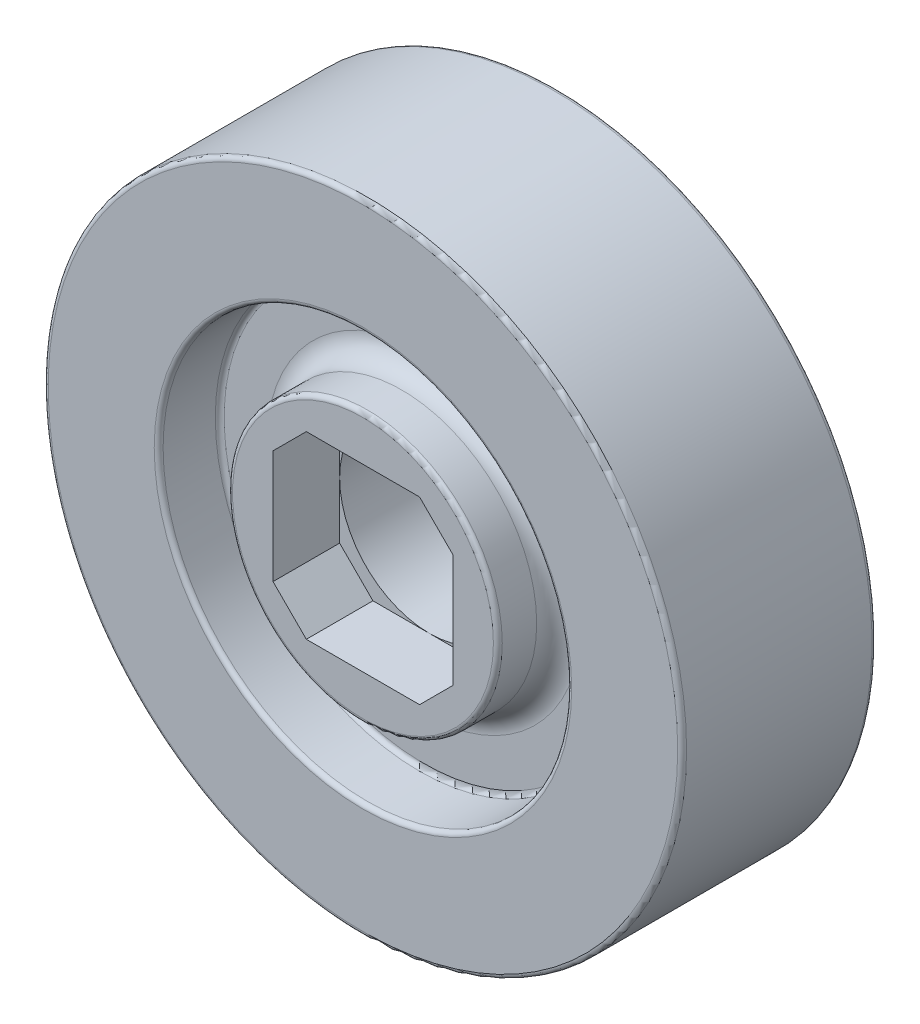
ISO-10303-21;
HEADER;
FILE_DESCRIPTION(('STEP AP214'),'2;1');
FILE_NAME('part.step','',(''),(''),'','','');
FILE_SCHEMA(('AUTOMOTIVE_DESIGN { 1 0 10303 214 1 1 1 1 }'));
ENDSEC;
DATA;
#1=APPLICATION_CONTEXT('core data for automotive mechanical design processes');
#2=APPLICATION_PROTOCOL_DEFINITION('international standard','automotive_design',2000,#1);
#3=PRODUCT_CONTEXT('',#1,'mechanical');
#4=PRODUCT('Part','Part','',(#3));
#5=PRODUCT_RELATED_PRODUCT_CATEGORY('part','',(#4));
#6=PRODUCT_DEFINITION_FORMATION('','',#4);
#7=PRODUCT_DEFINITION_CONTEXT('part definition',#1,'design');
#8=PRODUCT_DEFINITION('design','',#6,#7);
#9=PRODUCT_DEFINITION_SHAPE('','',#8);
#10=(LENGTH_UNIT() NAMED_UNIT(*) SI_UNIT(.MILLI.,.METRE.));
#11=(NAMED_UNIT(*) PLANE_ANGLE_UNIT() SI_UNIT($,.RADIAN.));
#12=(NAMED_UNIT(*) SI_UNIT($,.STERADIAN.) SOLID_ANGLE_UNIT());
#13=UNCERTAINTY_MEASURE_WITH_UNIT(LENGTH_MEASURE(1.E-05),#10,'distance_accuracy_value','');
#14=(GEOMETRIC_REPRESENTATION_CONTEXT(3) GLOBAL_UNCERTAINTY_ASSIGNED_CONTEXT((#13)) GLOBAL_UNIT_ASSIGNED_CONTEXT((#10,
#11,#12)) REPRESENTATION_CONTEXT('',''));
#15=CARTESIAN_POINT('',(0.,0.,0.));
#16=DIRECTION('',(0.,0.,1.));
#17=DIRECTION('',(1.,0.,0.));
#18=AXIS2_PLACEMENT_3D('',#15,#16,#17);
#19=CARTESIAN_POINT('',(-23.368,0.,-22.225));
#20=DIRECTION('',(0.,0.,-1.));
#21=DIRECTION('',(-1.,0.,0.));
#22=AXIS2_PLACEMENT_3D('',#19,#20,#21);
#23=PLANE('',#22);
#24=CARTESIAN_POINT('',(0.,0.,-22.225));
#25=DIRECTION('',(0.,0.,-1.));
#26=DIRECTION('',(-1.,0.,0.));
#27=AXIS2_PLACEMENT_3D('',#24,#25,#26);
#28=CIRCLE('',#27,36.0045);
#29=CARTESIAN_POINT('',(-36.0045,0.,-22.225));
#30=VERTEX_POINT('',#29);
#31=EDGE_CURVE('E215',#30,#30,#28,.T.);
#32=ORIENTED_EDGE('',*,*,#31,.T.);
#33=EDGE_LOOP('',(#32));
#34=FACE_BOUND('',#33,.T.);
#35=CARTESIAN_POINT('',(0.,0.,-22.225));
#36=DIRECTION('',(0.,0.,-1.));
#37=DIRECTION('',(-1.,0.,0.));
#38=AXIS2_PLACEMENT_3D('',#35,#36,#37);
#39=CIRCLE('',#38,23.876);
#40=CARTESIAN_POINT('',(-23.876,0.,-22.225));
#41=VERTEX_POINT('',#40);
#42=EDGE_CURVE('E212',#41,#41,#39,.F.);
#43=ORIENTED_EDGE('',*,*,#42,.T.);
#44=EDGE_LOOP('',(#43));
#45=FACE_BOUND('',#44,.T.);
#46=ADVANCED_FACE('F33',(#34,#45),#23,.T.);
#47=CARTESIAN_POINT('',(0.,0.,-23.33625));
#48=DIRECTION('',(0.,0.,-1.));
#49=DIRECTION('',(-1.,0.,0.));
#50=AXIS2_PLACEMENT_3D('',#47,#48,#49);
#51=CYLINDRICAL_SURFACE('',#50,36.5125);
#52=CARTESIAN_POINT('',(0.,0.,-0.508000000000002));
#53=DIRECTION('',(0.,0.,1.));
#54=DIRECTION('',(1.,0.,0.));
#55=AXIS2_PLACEMENT_3D('',#52,#53,#54);
#56=CIRCLE('',#55,36.5125);
#57=CARTESIAN_POINT('',(36.5125,0.,-0.508000000000002));
#58=VERTEX_POINT('',#57);
#59=EDGE_CURVE('E203',#58,#58,#56,.F.);
#60=ORIENTED_EDGE('',*,*,#59,.T.);
#61=EDGE_LOOP('',(#60));
#62=FACE_BOUND('',#61,.T.);
#63=CARTESIAN_POINT('',(0.,0.,-21.717));
#64=DIRECTION('',(0.,0.,-1.));
#65=DIRECTION('',(-1.,0.,0.));
#66=AXIS2_PLACEMENT_3D('',#63,#64,#65);
#67=CIRCLE('',#66,36.5125);
#68=CARTESIAN_POINT('',(-36.5125,0.,-21.717));
#69=VERTEX_POINT('',#68);
#70=EDGE_CURVE('E200',#69,#69,#67,.F.);
#71=ORIENTED_EDGE('',*,*,#70,.T.);
#72=EDGE_LOOP('',(#71));
#73=FACE_BOUND('',#72,.T.);
#74=ADVANCED_FACE('F249',(#62,#73),#51,.T.);
#75=CARTESIAN_POINT('',(-36.5125,0.,0.));
#76=DIRECTION('',(0.,0.,1.));
#77=DIRECTION('',(1.,0.,0.));
#78=AXIS2_PLACEMENT_3D('',#75,#76,#77);
#79=PLANE('',#78);
#80=CARTESIAN_POINT('',(0.,0.,0.));
#81=DIRECTION('',(0.,0.,1.));
#82=DIRECTION('',(1.,0.,0.));
#83=AXIS2_PLACEMENT_3D('',#80,#81,#82);
#84=CIRCLE('',#83,36.0045);
#85=CARTESIAN_POINT('',(36.0045,0.,0.));
#86=VERTEX_POINT('',#85);
#87=EDGE_CURVE('E209',#86,#86,#84,.T.);
#88=ORIENTED_EDGE('',*,*,#87,.T.);
#89=EDGE_LOOP('',(#88));
#90=FACE_BOUND('',#89,.T.);
#91=CARTESIAN_POINT('',(0.,0.,0.));
#92=DIRECTION('',(0.,0.,1.));
#93=DIRECTION('',(1.,0.,0.));
#94=AXIS2_PLACEMENT_3D('',#91,#92,#93);
#95=CIRCLE('',#94,23.876);
#96=CARTESIAN_POINT('',(23.876,0.,0.));
#97=VERTEX_POINT('',#96);
#98=EDGE_CURVE('E206',#97,#97,#95,.F.);
#99=ORIENTED_EDGE('',*,*,#98,.T.);
#100=EDGE_LOOP('',(#99));
#101=FACE_BOUND('',#100,.T.);
#102=ADVANCED_FACE('F255',(#90,#101),#79,.T.);
#103=CARTESIAN_POINT('',(0.,0.,-23.33625));
#104=DIRECTION('',(0.,0.,-1.));
#105=DIRECTION('',(-1.,0.,0.));
#106=AXIS2_PLACEMENT_3D('',#103,#104,#105);
#107=CYLINDRICAL_SURFACE('',#106,23.368);
#108=CARTESIAN_POINT('',(0.,0.,-6.477));
#109=DIRECTION('',(0.,0.,1.));
#110=DIRECTION('',(1.,0.,0.));
#111=AXIS2_PLACEMENT_3D('',#108,#109,#110);
#112=CIRCLE('',#111,23.368);
#113=CARTESIAN_POINT('',(23.368,0.,-6.477));
#114=VERTEX_POINT('',#113);
#115=EDGE_CURVE('E41',#114,#114,#112,.F.);
#116=ORIENTED_EDGE('',*,*,#115,.T.);
#117=EDGE_LOOP('',(#116));
#118=FACE_BOUND('',#117,.T.);
#119=CARTESIAN_POINT('',(0.,0.,-0.508000000000002));
#120=DIRECTION('',(0.,0.,1.));
#121=DIRECTION('',(1.,0.,0.));
#122=AXIS2_PLACEMENT_3D('',#119,#120,#121);
#123=CIRCLE('',#122,23.368);
#124=CARTESIAN_POINT('',(23.368,0.,-0.508000000000002));
#125=VERTEX_POINT('',#124);
#126=EDGE_CURVE('E227',#125,#125,#123,.T.);
#127=ORIENTED_EDGE('',*,*,#126,.T.);
#128=EDGE_LOOP('',(#127));
#129=FACE_BOUND('',#128,.T.);
#130=ADVANCED_FACE('F232',(#118,#129),#107,.F.);
#131=CARTESIAN_POINT('',(-23.368,0.,-6.985));
#132=DIRECTION('',(0.,0.,1.));
#133=DIRECTION('',(1.,0.,0.));
#134=AXIS2_PLACEMENT_3D('',#131,#132,#133);
#135=PLANE('',#134);
#136=CARTESIAN_POINT('',(0.,0.,-6.985));
#137=DIRECTION('',(0.,0.,1.));
#138=DIRECTION('',(1.,0.,0.));
#139=AXIS2_PLACEMENT_3D('',#136,#137,#138);
#140=CIRCLE('',#139,22.86);
#141=CARTESIAN_POINT('',(22.86,0.,-6.985));
#142=VERTEX_POINT('',#141);
#143=EDGE_CURVE('E11',#142,#142,#140,.T.);
#144=ORIENTED_EDGE('',*,*,#143,.T.);
#145=EDGE_LOOP('',(#144));
#146=FACE_BOUND('',#145,.T.);
#147=CARTESIAN_POINT('',(0.,0.,-6.985));
#148=DIRECTION('',(0.,0.,1.));
#149=DIRECTION('',(1.,0.,0.));
#150=AXIS2_PLACEMENT_3D('',#147,#148,#149);
#151=CIRCLE('',#150,17.9705);
#152=CARTESIAN_POINT('',(17.9705,0.,-6.985));
#153=VERTEX_POINT('',#152);
#154=EDGE_CURVE('E182',#153,#153,#151,.F.);
#155=ORIENTED_EDGE('',*,*,#154,.T.);
#156=EDGE_LOOP('',(#155));
#157=FACE_BOUND('',#156,.T.);
#158=ADVANCED_FACE('F398',(#146,#157),#135,.T.);
#159=CARTESIAN_POINT('',(0.,0.,-23.33625));
#160=DIRECTION('',(0.,0.,-1.));
#161=DIRECTION('',(-1.,0.,0.));
#162=AXIS2_PLACEMENT_3D('',#159,#160,#161);
#163=CYLINDRICAL_SURFACE('',#162,15.4305);
#164=CARTESIAN_POINT('',(0.,0.,-0.508000000000002));
#165=DIRECTION('',(0.,0.,1.));
#166=DIRECTION('',(1.,0.,0.));
#167=AXIS2_PLACEMENT_3D('',#164,#165,#166);
#168=CIRCLE('',#167,15.4305);
#169=CARTESIAN_POINT('',(15.4305,0.,-0.508000000000002));
#170=VERTEX_POINT('',#169);
#171=EDGE_CURVE('E221',#170,#170,#168,.F.);
#172=ORIENTED_EDGE('',*,*,#171,.T.);
#173=EDGE_LOOP('',(#172));
#174=FACE_BOUND('',#173,.T.);
#175=CARTESIAN_POINT('',(0.,0.,-4.445));
#176=DIRECTION('',(0.,0.,1.));
#177=DIRECTION('',(1.,0.,0.));
#178=AXIS2_PLACEMENT_3D('',#175,#176,#177);
#179=CIRCLE('',#178,15.4305);
#180=CARTESIAN_POINT('',(15.4305,0.,-4.445));
#181=VERTEX_POINT('',#180);
#182=EDGE_CURVE('E185',#181,#181,#179,.T.);
#183=ORIENTED_EDGE('',*,*,#182,.T.);
#184=EDGE_LOOP('',(#183));
#185=FACE_BOUND('',#184,.T.);
#186=ADVANCED_FACE('F394',(#174,#185),#163,.T.);
#187=CARTESIAN_POINT('',(-15.4305,0.,0.));
#188=DIRECTION('',(0.,0.,1.));
#189=DIRECTION('',(1.,0.,0.));
#190=AXIS2_PLACEMENT_3D('',#187,#188,#189);
#191=PLANE('',#190);
#192=CARTESIAN_POINT('',(0.,0.,0.));
#193=DIRECTION('',(0.,0.,1.));
#194=DIRECTION('',(1.,0.,0.));
#195=AXIS2_PLACEMENT_3D('',#192,#193,#194);
#196=CIRCLE('',#195,14.9225);
#197=CARTESIAN_POINT('',(14.9225,0.,0.));
#198=VERTEX_POINT('',#197);
#199=EDGE_CURVE('E224',#198,#198,#196,.T.);
#200=ORIENTED_EDGE('',*,*,#199,.T.);
#201=EDGE_LOOP('',(#200));
#202=FACE_BOUND('',#201,.T.);
#203=DIRECTION('',(1.,0.,0.));
#204=VECTOR('',#203,1.);
#205=CARTESIAN_POINT('',(-10.287,-10.287,0.));
#206=LINE('',#205,#204);
#207=CARTESIAN_POINT('',(-6.47699999999997,-10.287,0.));
#208=VERTEX_POINT('',#207);
#209=CARTESIAN_POINT('',(6.477,-10.287,0.));
#210=VERTEX_POINT('',#209);
#211=EDGE_CURVE('E142',#208,#210,#206,.T.);
#212=ORIENTED_EDGE('',*,*,#211,.F.);
#213=DIRECTION('',(0.707106781186551,-0.707106781186544,0.));
#214=VECTOR('',#213,1.);
#215=CARTESIAN_POINT('',(-6.47699999999997,-10.287,0.));
#216=LINE('',#215,#214);
#217=CARTESIAN_POINT('',(-10.287,-6.47700000000001,0.));
#218=VERTEX_POINT('',#217);
#219=EDGE_CURVE('E174',#208,#218,#216,.F.);
#220=ORIENTED_EDGE('',*,*,#219,.T.);
#221=DIRECTION('',(0.,-1.,0.));
#222=VECTOR('',#221,1.);
#223=CARTESIAN_POINT('',(-10.287,-10.287,0.));
#224=LINE('',#223,#222);
#225=CARTESIAN_POINT('',(-10.287,6.47699999999996,0.));
#226=VERTEX_POINT('',#225);
#227=EDGE_CURVE('E330',#226,#218,#224,.T.);
#228=ORIENTED_EDGE('',*,*,#227,.F.);
#229=DIRECTION('',(-0.707106781186543,-0.707106781186552,0.));
#230=VECTOR('',#229,1.);
#231=CARTESIAN_POINT('',(-10.287,6.47699999999996,0.));
#232=LINE('',#231,#230);
#233=CARTESIAN_POINT('',(-6.47700000000001,10.287,0.));
#234=VERTEX_POINT('',#233);
#235=EDGE_CURVE('E180',#226,#234,#232,.F.);
#236=ORIENTED_EDGE('',*,*,#235,.T.);
#237=DIRECTION('',(-1.,0.,0.));
#238=VECTOR('',#237,1.);
#239=CARTESIAN_POINT('',(-10.287,10.287,0.));
#240=LINE('',#239,#238);
#241=CARTESIAN_POINT('',(6.47699999999996,10.287,0.));
#242=VERTEX_POINT('',#241);
#243=EDGE_CURVE('E333',#242,#234,#240,.T.);
#244=ORIENTED_EDGE('',*,*,#243,.F.);
#245=DIRECTION('',(-0.707106781186551,0.707106781186544,0.));
#246=VECTOR('',#245,1.);
#247=CARTESIAN_POINT('',(6.47699999999996,10.287,0.));
#248=LINE('',#247,#246);
#249=CARTESIAN_POINT('',(10.287,6.477,0.));
#250=VERTEX_POINT('',#249);
#251=EDGE_CURVE('E178',#242,#250,#248,.F.);
#252=ORIENTED_EDGE('',*,*,#251,.T.);
#253=DIRECTION('',(0.,1.,0.));
#254=VECTOR('',#253,1.);
#255=CARTESIAN_POINT('',(10.287,-10.287,0.));
#256=LINE('',#255,#254);
#257=CARTESIAN_POINT('',(10.287,-6.47699999999997,0.));
#258=VERTEX_POINT('',#257);
#259=EDGE_CURVE('E335',#258,#250,#256,.T.);
#260=ORIENTED_EDGE('',*,*,#259,.F.);
#261=DIRECTION('',(0.707106781186544,0.707106781186551,0.));
#262=VECTOR('',#261,1.);
#263=CARTESIAN_POINT('',(10.287,-6.47699999999997,0.));
#264=LINE('',#263,#262);
#265=EDGE_CURVE('E176',#258,#210,#264,.F.);
#266=ORIENTED_EDGE('',*,*,#265,.T.);
#267=EDGE_LOOP('',(#212,#220,#228,#236,#244,#252,#260,#266));
#268=FACE_BOUND('',#267,.T.);
#269=ADVANCED_FACE('F353',(#202,#268),#191,.T.);
#270=CARTESIAN_POINT('',(0.,0.,-23.33625));
#271=DIRECTION('',(0.,0.,-1.));
#272=DIRECTION('',(-1.,0.,0.));
#273=AXIS2_PLACEMENT_3D('',#270,#271,#272);
#274=CYLINDRICAL_SURFACE('',#273,10.287);
#275=CARTESIAN_POINT('',(0.,0.,-7.62));
#276=DIRECTION('',(0.,0.,-1.));
#277=DIRECTION('',(-1.,0.,0.));
#278=AXIS2_PLACEMENT_3D('',#275,#276,#277);
#279=CIRCLE('',#278,10.287);
#280=CARTESIAN_POINT('',(-10.287,0.,-7.62));
#281=VERTEX_POINT('',#280);
#282=CARTESIAN_POINT('',(0.,10.287,-7.62));
#283=VERTEX_POINT('',#282);
#284=EDGE_CURVE('E136',#281,#283,#279,.T.);
#285=ORIENTED_EDGE('',*,*,#284,.F.);
#286=CARTESIAN_POINT('',(0.,-10.287,-7.62));
#287=VERTEX_POINT('',#286);
#288=EDGE_CURVE('E146',#287,#281,#279,.T.);
#289=ORIENTED_EDGE('',*,*,#288,.F.);
#290=CARTESIAN_POINT('',(10.287,0.,-7.62));
#291=VERTEX_POINT('',#290);
#292=EDGE_CURVE('E118',#291,#287,#279,.T.);
#293=ORIENTED_EDGE('',*,*,#292,.F.);
#294=EDGE_CURVE('E130',#283,#291,#279,.T.);
#295=ORIENTED_EDGE('',*,*,#294,.F.);
#296=EDGE_LOOP('',(#285,#289,#293,#295));
#297=FACE_BOUND('',#296,.T.);
#298=CARTESIAN_POINT('',(0.,0.,-18.288));
#299=DIRECTION('',(0.,0.,-1.));
#300=DIRECTION('',(-1.,0.,0.));
#301=AXIS2_PLACEMENT_3D('',#298,#299,#300);
#302=CIRCLE('',#301,10.287);
#303=CARTESIAN_POINT('',(-10.287,0.,-18.288));
#304=VERTEX_POINT('',#303);
#305=EDGE_CURVE('E147',#304,#304,#302,.T.);
#306=ORIENTED_EDGE('',*,*,#305,.T.);
#307=EDGE_LOOP('',(#306));
#308=FACE_BOUND('',#307,.T.);
#309=ADVANCED_FACE('F143',(#297,#308),#274,.F.);
#310=CARTESIAN_POINT('',(-10.287,0.,-18.288));
#311=DIRECTION('',(0.,0.,-1.));
#312=DIRECTION('',(-1.,0.,0.));
#313=AXIS2_PLACEMENT_3D('',#310,#311,#312);
#314=PLANE('',#313);
#315=CARTESIAN_POINT('',(0.,0.,-18.288));
#316=DIRECTION('',(0.,0.,-1.));
#317=DIRECTION('',(-1.,0.,0.));
#318=AXIS2_PLACEMENT_3D('',#315,#316,#317);
#319=CIRCLE('',#318,12.954);
#320=CARTESIAN_POINT('',(-12.954,0.,-18.288));
#321=VERTEX_POINT('',#320);
#322=EDGE_CURVE('E188',#321,#321,#319,.T.);
#323=ORIENTED_EDGE('',*,*,#322,.T.);
#324=EDGE_LOOP('',(#323));
#325=FACE_BOUND('',#324,.T.);
#326=ORIENTED_EDGE('',*,*,#305,.F.);
#327=EDGE_LOOP('',(#326));
#328=FACE_BOUND('',#327,.T.);
#329=ADVANCED_FACE('F385',(#325,#328),#314,.T.);
#330=CARTESIAN_POINT('',(0.,0.,-23.33625));
#331=DIRECTION('',(0.,0.,-1.));
#332=DIRECTION('',(-1.,0.,0.));
#333=AXIS2_PLACEMENT_3D('',#330,#331,#332);
#334=CYLINDRICAL_SURFACE('',#333,15.494);
#335=CARTESIAN_POINT('',(0.,0.,-15.748));
#336=DIRECTION('',(0.,0.,-1.));
#337=DIRECTION('',(-1.,0.,0.));
#338=AXIS2_PLACEMENT_3D('',#335,#336,#337);
#339=CIRCLE('',#338,15.494);
#340=CARTESIAN_POINT('',(-15.494,0.,-15.748));
#341=VERTEX_POINT('',#340);
#342=EDGE_CURVE('E191',#341,#341,#339,.F.);
#343=ORIENTED_EDGE('',*,*,#342,.T.);
#344=EDGE_LOOP('',(#343));
#345=FACE_BOUND('',#344,.T.);
#346=CARTESIAN_POINT('',(0.,0.,-15.24));
#347=DIRECTION('',(0.,0.,-1.));
#348=DIRECTION('',(-1.,0.,0.));
#349=AXIS2_PLACEMENT_3D('',#346,#347,#348);
#350=CIRCLE('',#349,15.494);
#351=CARTESIAN_POINT('',(-15.494,0.,-15.24));
#352=VERTEX_POINT('',#351);
#353=EDGE_CURVE('E321',#352,#352,#350,.T.);
#354=ORIENTED_EDGE('',*,*,#353,.T.);
#355=EDGE_LOOP('',(#354));
#356=FACE_BOUND('',#355,.T.);
#357=ADVANCED_FACE('F317',(#345,#356),#334,.T.);
#358=CARTESIAN_POINT('',(-15.494,0.,-15.24));
#359=DIRECTION('',(0.,0.,-1.));
#360=DIRECTION('',(-1.,0.,0.));
#361=AXIS2_PLACEMENT_3D('',#358,#359,#360);
#362=PLANE('',#361);
#363=CARTESIAN_POINT('',(0.,0.,-15.24));
#364=DIRECTION('',(0.,0.,-1.));
#365=DIRECTION('',(-1.,0.,0.));
#366=AXIS2_PLACEMENT_3D('',#363,#364,#365);
#367=CIRCLE('',#366,20.828);
#368=CARTESIAN_POINT('',(-20.828,0.,-15.24));
#369=VERTEX_POINT('',#368);
#370=EDGE_CURVE('E194',#369,#369,#367,.T.);
#371=ORIENTED_EDGE('',*,*,#370,.T.);
#372=EDGE_LOOP('',(#371));
#373=FACE_BOUND('',#372,.T.);
#374=ORIENTED_EDGE('',*,*,#353,.F.);
#375=EDGE_LOOP('',(#374));
#376=FACE_BOUND('',#375,.T.);
#377=ADVANCED_FACE('F309',(#373,#376),#362,.T.);
#378=CARTESIAN_POINT('',(0.,0.,-23.33625));
#379=DIRECTION('',(0.,0.,-1.));
#380=DIRECTION('',(-1.,0.,0.));
#381=AXIS2_PLACEMENT_3D('',#378,#379,#380);
#382=CYLINDRICAL_SURFACE('',#381,23.368);
#383=CARTESIAN_POINT('',(0.,0.,-21.717));
#384=DIRECTION('',(0.,0.,-1.));
#385=DIRECTION('',(-1.,0.,0.));
#386=AXIS2_PLACEMENT_3D('',#383,#384,#385);
#387=CIRCLE('',#386,23.368);
#388=CARTESIAN_POINT('',(-23.368,0.,-21.717));
#389=VERTEX_POINT('',#388);
#390=EDGE_CURVE('E218',#389,#389,#387,.T.);
#391=ORIENTED_EDGE('',*,*,#390,.T.);
#392=EDGE_LOOP('',(#391));
#393=FACE_BOUND('',#392,.T.);
#394=CARTESIAN_POINT('',(0.,0.,-17.78));
#395=DIRECTION('',(0.,0.,-1.));
#396=DIRECTION('',(-1.,0.,0.));
#397=AXIS2_PLACEMENT_3D('',#394,#395,#396);
#398=CIRCLE('',#397,23.368);
#399=CARTESIAN_POINT('',(-23.368,0.,-17.78));
#400=VERTEX_POINT('',#399);
#401=EDGE_CURVE('E197',#400,#400,#398,.F.);
#402=ORIENTED_EDGE('',*,*,#401,.T.);
#403=EDGE_LOOP('',(#402));
#404=FACE_BOUND('',#403,.T.);
#405=ADVANCED_FACE('F306',(#393,#404),#382,.F.);
#406=CARTESIAN_POINT('',(10.287,-10.287,-7.62));
#407=DIRECTION('',(1.,0.,0.));
#408=DIRECTION('',(0.,0.,-1.));
#409=AXIS2_PLACEMENT_3D('',#406,#407,#408);
#410=PLANE('',#409);
#411=DIRECTION('',(0.,1.,0.));
#412=VECTOR('',#411,1.);
#413=CARTESIAN_POINT('',(10.287,-10.287,-7.62));
#414=LINE('',#413,#412);
#415=CARTESIAN_POINT('',(10.287,-6.47699999999997,-7.62));
#416=VERTEX_POINT('',#415);
#417=EDGE_CURVE('E113',#416,#291,#414,.T.);
#418=ORIENTED_EDGE('',*,*,#417,.F.);
#419=DIRECTION('',(0.,0.,1.));
#420=VECTOR('',#419,1.);
#421=CARTESIAN_POINT('',(10.287,-6.47699999999997,0.));
#422=LINE('',#421,#420);
#423=EDGE_CURVE('E164',#416,#258,#422,.T.);
#424=ORIENTED_EDGE('',*,*,#423,.T.);
#425=ORIENTED_EDGE('',*,*,#259,.T.);
#426=DIRECTION('',(0.,0.,-1.));
#427=VECTOR('',#426,1.);
#428=CARTESIAN_POINT('',(10.287,6.477,-7.62));
#429=LINE('',#428,#427);
#430=CARTESIAN_POINT('',(10.287,6.477,-7.62));
#431=VERTEX_POINT('',#430);
#432=EDGE_CURVE('E141',#250,#431,#429,.T.);
#433=ORIENTED_EDGE('',*,*,#432,.T.);
#434=EDGE_CURVE('E127',#291,#431,#414,.T.);
#435=ORIENTED_EDGE('',*,*,#434,.F.);
#436=EDGE_LOOP('',(#418,#424,#425,#433,#435));
#437=FACE_BOUND('',#436,.T.);
#438=ADVANCED_FACE('F138',(#437),#410,.F.);
#439=CARTESIAN_POINT('',(-10.287,-10.287,-7.62));
#440=DIRECTION('',(0.,-1.,0.));
#441=DIRECTION('',(0.,0.,-1.));
#442=AXIS2_PLACEMENT_3D('',#439,#440,#441);
#443=PLANE('',#442);
#444=DIRECTION('',(1.,0.,0.));
#445=VECTOR('',#444,1.);
#446=CARTESIAN_POINT('',(-10.287,-10.287,-7.62));
#447=LINE('',#446,#445);
#448=CARTESIAN_POINT('',(-6.47699999999997,-10.287,-7.62));
#449=VERTEX_POINT('',#448);
#450=EDGE_CURVE('E323',#449,#287,#447,.T.);
#451=ORIENTED_EDGE('',*,*,#450,.F.);
#452=DIRECTION('',(0.,0.,1.));
#453=VECTOR('',#452,1.);
#454=CARTESIAN_POINT('',(-6.47699999999997,-10.287,0.));
#455=LINE('',#454,#453);
#456=EDGE_CURVE('E153',#449,#208,#455,.T.);
#457=ORIENTED_EDGE('',*,*,#456,.T.);
#458=ORIENTED_EDGE('',*,*,#211,.T.);
#459=DIRECTION('',(0.,0.,-1.));
#460=VECTOR('',#459,1.);
#461=CARTESIAN_POINT('',(6.477,-10.287,-7.62));
#462=LINE('',#461,#460);
#463=CARTESIAN_POINT('',(6.477,-10.287,-7.62));
#464=VERTEX_POINT('',#463);
#465=EDGE_CURVE('E151',#210,#464,#462,.T.);
#466=ORIENTED_EDGE('',*,*,#465,.T.);
#467=EDGE_CURVE('E325',#287,#464,#447,.T.);
#468=ORIENTED_EDGE('',*,*,#467,.F.);
#469=EDGE_LOOP('',(#451,#457,#458,#466,#468));
#470=FACE_BOUND('',#469,.T.);
#471=ADVANCED_FACE('F359',(#470),#443,.F.);
#472=CARTESIAN_POINT('',(-10.287,-10.287,-7.62));
#473=DIRECTION('',(-1.,0.,0.));
#474=DIRECTION('',(0.,0.,1.));
#475=AXIS2_PLACEMENT_3D('',#472,#473,#474);
#476=PLANE('',#475);
#477=ORIENTED_EDGE('',*,*,#227,.T.);
#478=DIRECTION('',(0.,0.,-1.));
#479=VECTOR('',#478,1.);
#480=CARTESIAN_POINT('',(-10.287,-6.47700000000001,-7.62));
#481=LINE('',#480,#479);
#482=CARTESIAN_POINT('',(-10.287,-6.47700000000001,-7.62));
#483=VERTEX_POINT('',#482);
#484=EDGE_CURVE('E159',#218,#483,#481,.T.);
#485=ORIENTED_EDGE('',*,*,#484,.T.);
#486=DIRECTION('',(0.,-1.,0.));
#487=VECTOR('',#486,1.);
#488=CARTESIAN_POINT('',(-10.287,-10.287,-7.62));
#489=LINE('',#488,#487);
#490=EDGE_CURVE('E339',#281,#483,#489,.T.);
#491=ORIENTED_EDGE('',*,*,#490,.F.);
#492=CARTESIAN_POINT('',(-10.287,6.47699999999996,-7.62));
#493=VERTEX_POINT('',#492);
#494=EDGE_CURVE('E337',#493,#281,#489,.T.);
#495=ORIENTED_EDGE('',*,*,#494,.F.);
#496=DIRECTION('',(0.,0.,1.));
#497=VECTOR('',#496,1.);
#498=CARTESIAN_POINT('',(-10.287,6.47699999999996,0.));
#499=LINE('',#498,#497);
#500=EDGE_CURVE('E156',#493,#226,#499,.T.);
#501=ORIENTED_EDGE('',*,*,#500,.T.);
#502=EDGE_LOOP('',(#477,#485,#491,#495,#501));
#503=FACE_BOUND('',#502,.T.);
#504=ADVANCED_FACE('F348',(#503),#476,.F.);
#505=CARTESIAN_POINT('',(-10.287,10.287,-7.62));
#506=DIRECTION('',(0.,1.,0.));
#507=DIRECTION('',(0.,0.,1.));
#508=AXIS2_PLACEMENT_3D('',#505,#506,#507);
#509=PLANE('',#508);
#510=DIRECTION('',(-1.,0.,0.));
#511=VECTOR('',#510,1.);
#512=CARTESIAN_POINT('',(-10.287,10.287,-7.62));
#513=LINE('',#512,#511);
#514=CARTESIAN_POINT('',(6.47699999999996,10.287,-7.62));
#515=VERTEX_POINT('',#514);
#516=EDGE_CURVE('E132',#515,#283,#513,.T.);
#517=ORIENTED_EDGE('',*,*,#516,.F.);
#518=DIRECTION('',(0.,0.,1.));
#519=VECTOR('',#518,1.);
#520=CARTESIAN_POINT('',(6.47699999999996,10.287,0.));
#521=LINE('',#520,#519);
#522=EDGE_CURVE('E168',#515,#242,#521,.T.);
#523=ORIENTED_EDGE('',*,*,#522,.T.);
#524=ORIENTED_EDGE('',*,*,#243,.T.);
#525=DIRECTION('',(0.,0.,-1.));
#526=VECTOR('',#525,1.);
#527=CARTESIAN_POINT('',(-6.47700000000001,10.287,-7.62));
#528=LINE('',#527,#526);
#529=CARTESIAN_POINT('',(-6.47700000000001,10.287,-7.62));
#530=VERTEX_POINT('',#529);
#531=EDGE_CURVE('E56',#234,#530,#528,.T.);
#532=ORIENTED_EDGE('',*,*,#531,.T.);
#533=EDGE_CURVE('E126',#283,#530,#513,.T.);
#534=ORIENTED_EDGE('',*,*,#533,.F.);
#535=EDGE_LOOP('',(#517,#523,#524,#532,#534));
#536=FACE_BOUND('',#535,.T.);
#537=ADVANCED_FACE('F370',(#536),#509,.F.);
#538=CARTESIAN_POINT('',(0.,0.,-7.62));
#539=DIRECTION('',(0.,0.,-1.));
#540=DIRECTION('',(-1.,0.,0.));
#541=AXIS2_PLACEMENT_3D('',#538,#539,#540);
#542=PLANE('',#541);
#543=ORIENTED_EDGE('',*,*,#533,.T.);
#544=DIRECTION('',(0.707106781186543,0.707106781186552,0.));
#545=VECTOR('',#544,1.);
#546=CARTESIAN_POINT('',(-10.287,6.47699999999996,-7.62));
#547=LINE('',#546,#545);
#548=EDGE_CURVE('E172',#530,#493,#547,.F.);
#549=ORIENTED_EDGE('',*,*,#548,.T.);
#550=ORIENTED_EDGE('',*,*,#494,.T.);
#551=ORIENTED_EDGE('',*,*,#284,.T.);
#552=EDGE_LOOP('',(#543,#549,#550,#551));
#553=FACE_BOUND('',#552,.T.);
#554=ADVANCED_FACE('F343',(#553),#542,.F.);
#555=ORIENTED_EDGE('',*,*,#434,.T.);
#556=DIRECTION('',(0.707106781186551,-0.707106781186544,0.));
#557=VECTOR('',#556,1.);
#558=CARTESIAN_POINT('',(6.47699999999996,10.287,-7.62));
#559=LINE('',#558,#557);
#560=EDGE_CURVE('E48',#431,#515,#559,.F.);
#561=ORIENTED_EDGE('',*,*,#560,.T.);
#562=ORIENTED_EDGE('',*,*,#516,.T.);
#563=ORIENTED_EDGE('',*,*,#294,.T.);
#564=EDGE_LOOP('',(#555,#561,#562,#563));
#565=FACE_BOUND('',#564,.T.);
#566=ADVANCED_FACE('F131',(#565),#542,.F.);
#567=ORIENTED_EDGE('',*,*,#467,.T.);
#568=DIRECTION('',(-0.707106781186544,-0.707106781186551,0.));
#569=VECTOR('',#568,1.);
#570=CARTESIAN_POINT('',(10.287,-6.47699999999997,-7.62));
#571=LINE('',#570,#569);
#572=EDGE_CURVE('E121',#464,#416,#571,.F.);
#573=ORIENTED_EDGE('',*,*,#572,.T.);
#574=ORIENTED_EDGE('',*,*,#417,.T.);
#575=ORIENTED_EDGE('',*,*,#292,.T.);
#576=EDGE_LOOP('',(#567,#573,#574,#575));
#577=FACE_BOUND('',#576,.T.);
#578=ADVANCED_FACE('F116',(#577),#542,.F.);
#579=ORIENTED_EDGE('',*,*,#490,.T.);
#580=DIRECTION('',(-0.707106781186551,0.707106781186544,0.));
#581=VECTOR('',#580,1.);
#582=CARTESIAN_POINT('',(-6.47699999999997,-10.287,-7.62));
#583=LINE('',#582,#581);
#584=EDGE_CURVE('E161',#483,#449,#583,.F.);
#585=ORIENTED_EDGE('',*,*,#584,.T.);
#586=ORIENTED_EDGE('',*,*,#450,.T.);
#587=ORIENTED_EDGE('',*,*,#288,.T.);
#588=EDGE_LOOP('',(#579,#585,#586,#587));
#589=FACE_BOUND('',#588,.T.);
#590=ADVANCED_FACE('F265',(#589),#542,.F.);
#591=CARTESIAN_POINT('',(-6.47699999999997,-10.287,-7.62));
#592=DIRECTION('',(0.707106781186544,0.707106781186551,0.));
#593=DIRECTION('',(0.,0.,-1.));
#594=AXIS2_PLACEMENT_3D('',#591,#592,#593);
#595=PLANE('',#594);
#596=ORIENTED_EDGE('',*,*,#584,.F.);
#597=ORIENTED_EDGE('',*,*,#484,.F.);
#598=ORIENTED_EDGE('',*,*,#219,.F.);
#599=ORIENTED_EDGE('',*,*,#456,.F.);
#600=EDGE_LOOP('',(#596,#597,#598,#599));
#601=FACE_BOUND('',#600,.T.);
#602=ADVANCED_FACE('F261',(#601),#595,.T.);
#603=CARTESIAN_POINT('',(10.287,-6.47699999999997,-7.62));
#604=DIRECTION('',(-0.707106781186551,0.707106781186544,0.));
#605=DIRECTION('',(0.,0.,-1.));
#606=AXIS2_PLACEMENT_3D('',#603,#604,#605);
#607=PLANE('',#606);
#608=ORIENTED_EDGE('',*,*,#572,.F.);
#609=ORIENTED_EDGE('',*,*,#465,.F.);
#610=ORIENTED_EDGE('',*,*,#265,.F.);
#611=ORIENTED_EDGE('',*,*,#423,.F.);
#612=EDGE_LOOP('',(#608,#609,#610,#611));
#613=FACE_BOUND('',#612,.T.);
#614=ADVANCED_FACE('F264',(#613),#607,.T.);
#615=CARTESIAN_POINT('',(6.47699999999996,10.287,-7.62));
#616=DIRECTION('',(-0.707106781186544,-0.707106781186551,0.));
#617=DIRECTION('',(0.,0.,-1.));
#618=AXIS2_PLACEMENT_3D('',#615,#616,#617);
#619=PLANE('',#618);
#620=ORIENTED_EDGE('',*,*,#560,.F.);
#621=ORIENTED_EDGE('',*,*,#432,.F.);
#622=ORIENTED_EDGE('',*,*,#251,.F.);
#623=ORIENTED_EDGE('',*,*,#522,.F.);
#624=EDGE_LOOP('',(#620,#621,#622,#623));
#625=FACE_BOUND('',#624,.T.);
#626=ADVANCED_FACE('F269',(#625),#619,.T.);
#627=CARTESIAN_POINT('',(-10.287,6.47699999999996,-7.62));
#628=DIRECTION('',(0.707106781186552,-0.707106781186543,0.));
#629=DIRECTION('',(0.,0.,-1.));
#630=AXIS2_PLACEMENT_3D('',#627,#628,#629);
#631=PLANE('',#630);
#632=ORIENTED_EDGE('',*,*,#548,.F.);
#633=ORIENTED_EDGE('',*,*,#531,.F.);
#634=ORIENTED_EDGE('',*,*,#235,.F.);
#635=ORIENTED_EDGE('',*,*,#500,.F.);
#636=EDGE_LOOP('',(#632,#633,#634,#635));
#637=FACE_BOUND('',#636,.T.);
#638=ADVANCED_FACE('F273',(#637),#631,.T.);
#639=CARTESIAN_POINT('',(0.,0.,-4.445));
#640=DIRECTION('',(0.,0.,1.));
#641=DIRECTION('',(1.,0.,0.));
#642=AXIS2_PLACEMENT_3D('',#639,#640,#641);
#643=TOROIDAL_SURFACE('',#642,17.9705,2.54);
#644=ORIENTED_EDGE('',*,*,#182,.F.);
#645=EDGE_LOOP('',(#644));
#646=FACE_BOUND('',#645,.T.);
#647=ORIENTED_EDGE('',*,*,#154,.F.);
#648=EDGE_LOOP('',(#647));
#649=FACE_BOUND('',#648,.T.);
#650=ADVANCED_FACE('F277',(#646,#649),#643,.F.);
#651=CARTESIAN_POINT('',(0.,0.,-15.748));
#652=DIRECTION('',(0.,0.,-1.));
#653=DIRECTION('',(-1.,0.,0.));
#654=AXIS2_PLACEMENT_3D('',#651,#652,#653);
#655=TOROIDAL_SURFACE('',#654,12.954,2.54);
#656=ORIENTED_EDGE('',*,*,#342,.F.);
#657=EDGE_LOOP('',(#656));
#658=FACE_BOUND('',#657,.T.);
#659=ORIENTED_EDGE('',*,*,#322,.F.);
#660=EDGE_LOOP('',(#659));
#661=FACE_BOUND('',#660,.T.);
#662=ADVANCED_FACE('F281',(#658,#661),#655,.T.);
#663=CARTESIAN_POINT('',(0.,0.,-17.78));
#664=DIRECTION('',(0.,0.,-1.));
#665=DIRECTION('',(-1.,0.,0.));
#666=AXIS2_PLACEMENT_3D('',#663,#664,#665);
#667=TOROIDAL_SURFACE('',#666,20.828,2.54);
#668=ORIENTED_EDGE('',*,*,#401,.F.);
#669=EDGE_LOOP('',(#668));
#670=FACE_BOUND('',#669,.T.);
#671=ORIENTED_EDGE('',*,*,#370,.F.);
#672=EDGE_LOOP('',(#671));
#673=FACE_BOUND('',#672,.T.);
#674=ADVANCED_FACE('F285',(#670,#673),#667,.F.);
#675=CARTESIAN_POINT('',(0.,0.,-0.508000000000002));
#676=DIRECTION('',(0.,0.,1.));
#677=DIRECTION('',(1.,0.,0.));
#678=AXIS2_PLACEMENT_3D('',#675,#676,#677);
#679=TOROIDAL_SURFACE('',#678,36.0045,0.508);
#680=ORIENTED_EDGE('',*,*,#87,.F.);
#681=EDGE_LOOP('',(#680));
#682=FACE_BOUND('',#681,.T.);
#683=ORIENTED_EDGE('',*,*,#59,.F.);
#684=EDGE_LOOP('',(#683));
#685=FACE_BOUND('',#684,.T.);
#686=ADVANCED_FACE('F289',(#682,#685),#679,.T.);
#687=CARTESIAN_POINT('',(0.,0.,-21.717));
#688=DIRECTION('',(0.,0.,-1.));
#689=DIRECTION('',(-1.,0.,0.));
#690=AXIS2_PLACEMENT_3D('',#687,#688,#689);
#691=TOROIDAL_SURFACE('',#690,36.0045,0.508);
#692=ORIENTED_EDGE('',*,*,#70,.F.);
#693=EDGE_LOOP('',(#692));
#694=FACE_BOUND('',#693,.T.);
#695=ORIENTED_EDGE('',*,*,#31,.F.);
#696=EDGE_LOOP('',(#695));
#697=FACE_BOUND('',#696,.T.);
#698=ADVANCED_FACE('F293',(#694,#697),#691,.T.);
#699=CARTESIAN_POINT('',(0.,0.,-21.717));
#700=DIRECTION('',(0.,0.,-1.));
#701=DIRECTION('',(-1.,0.,0.));
#702=AXIS2_PLACEMENT_3D('',#699,#700,#701);
#703=TOROIDAL_SURFACE('',#702,23.876,0.508);
#704=ORIENTED_EDGE('',*,*,#42,.F.);
#705=EDGE_LOOP('',(#704));
#706=FACE_BOUND('',#705,.T.);
#707=ORIENTED_EDGE('',*,*,#390,.F.);
#708=EDGE_LOOP('',(#707));
#709=FACE_BOUND('',#708,.T.);
#710=ADVANCED_FACE('F244',(#706,#709),#703,.T.);
#711=CARTESIAN_POINT('',(0.,0.,-0.508000000000002));
#712=DIRECTION('',(0.,0.,1.));
#713=DIRECTION('',(1.,0.,0.));
#714=AXIS2_PLACEMENT_3D('',#711,#712,#713);
#715=TOROIDAL_SURFACE('',#714,14.9225,0.508);
#716=ORIENTED_EDGE('',*,*,#199,.F.);
#717=EDGE_LOOP('',(#716));
#718=FACE_BOUND('',#717,.T.);
#719=ORIENTED_EDGE('',*,*,#171,.F.);
#720=EDGE_LOOP('',(#719));
#721=FACE_BOUND('',#720,.T.);
#722=ADVANCED_FACE('F237',(#718,#721),#715,.T.);
#723=CARTESIAN_POINT('',(0.,0.,-6.477));
#724=DIRECTION('',(0.,0.,1.));
#725=DIRECTION('',(1.,0.,0.));
#726=AXIS2_PLACEMENT_3D('',#723,#724,#725);
#727=TOROIDAL_SURFACE('',#726,22.86,0.508);
#728=ORIENTED_EDGE('',*,*,#143,.F.);
#729=EDGE_LOOP('',(#728));
#730=FACE_BOUND('',#729,.T.);
#731=ORIENTED_EDGE('',*,*,#115,.F.);
#732=EDGE_LOOP('',(#731));
#733=FACE_BOUND('',#732,.T.);
#734=ADVANCED_FACE('F235',(#730,#733),#727,.F.);
#735=CARTESIAN_POINT('',(0.,0.,-0.508000000000002));
#736=DIRECTION('',(0.,0.,1.));
#737=DIRECTION('',(1.,0.,0.));
#738=AXIS2_PLACEMENT_3D('',#735,#736,#737);
#739=TOROIDAL_SURFACE('',#738,23.876,0.508);
#740=ORIENTED_EDGE('',*,*,#126,.F.);
#741=EDGE_LOOP('',(#740));
#742=FACE_BOUND('',#741,.T.);
#743=ORIENTED_EDGE('',*,*,#98,.F.);
#744=EDGE_LOOP('',(#743));
#745=FACE_BOUND('',#744,.T.);
#746=ADVANCED_FACE('F35',(#742,#745),#739,.T.);
#747=CLOSED_SHELL('',(#46,#74,#102,#130,#158,#186,#269,#309,#329,#357,#377,#405,#438,#471,#504,
#537,#554,#566,#578,#590,#602,#614,#626,#638,#650,#662,#674,#686,#698,#710,#722,#734,#746));
#748=MANIFOLD_SOLID_BREP('B2',#747);
#749=ADVANCED_BREP_SHAPE_REPRESENTATION('',(#18,#748),#14);
#750=SHAPE_DEFINITION_REPRESENTATION(#9,#749);
ENDSEC;
END-ISO-10303-21;
